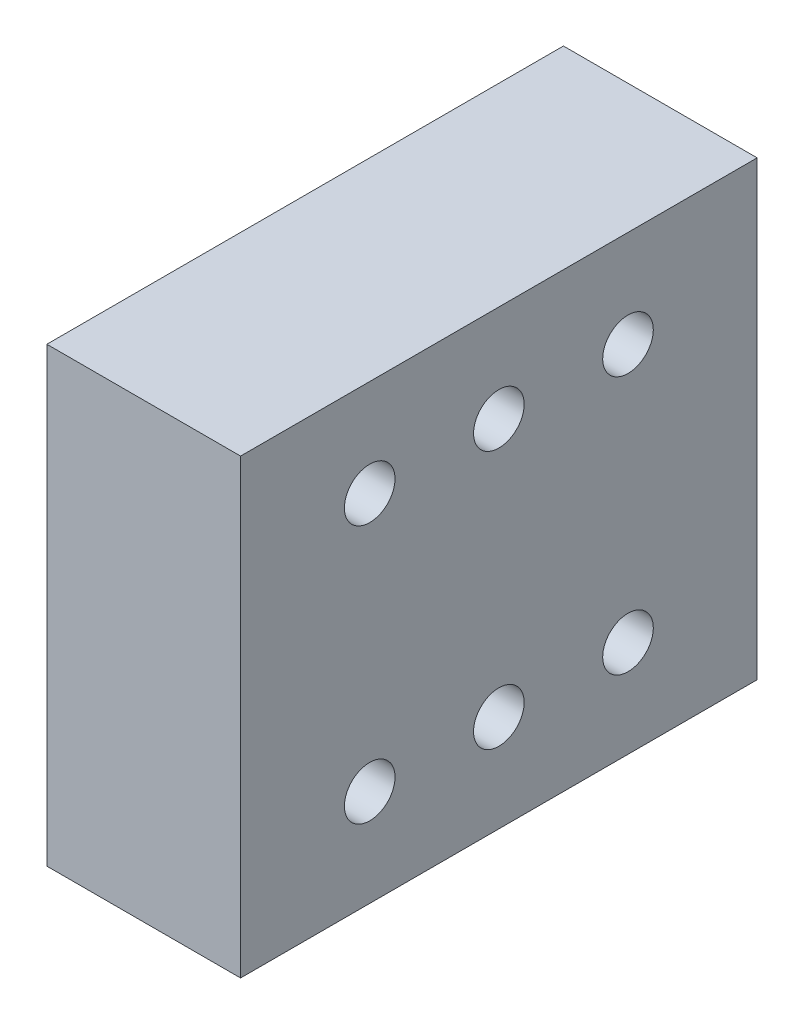
ISO-10303-21;
HEADER;
FILE_DESCRIPTION(('STEP AP214'),'2;1');
FILE_NAME('part.step','',(''),(''),'','','');
FILE_SCHEMA(('AUTOMOTIVE_DESIGN { 1 0 10303 214 1 1 1 1 }'));
ENDSEC;
DATA;
#1=APPLICATION_CONTEXT('core data for automotive mechanical design processes');
#2=APPLICATION_PROTOCOL_DEFINITION('international standard','automotive_design',2000,#1);
#3=PRODUCT_CONTEXT('',#1,'mechanical');
#4=PRODUCT('Part','Part','',(#3));
#5=PRODUCT_RELATED_PRODUCT_CATEGORY('part','',(#4));
#6=PRODUCT_DEFINITION_FORMATION('','',#4);
#7=PRODUCT_DEFINITION_CONTEXT('part definition',#1,'design');
#8=PRODUCT_DEFINITION('design','',#6,#7);
#9=PRODUCT_DEFINITION_SHAPE('','',#8);
#10=(LENGTH_UNIT() NAMED_UNIT(*) SI_UNIT(.MILLI.,.METRE.));
#11=(NAMED_UNIT(*) PLANE_ANGLE_UNIT() SI_UNIT($,.RADIAN.));
#12=(NAMED_UNIT(*) SI_UNIT($,.STERADIAN.) SOLID_ANGLE_UNIT());
#13=UNCERTAINTY_MEASURE_WITH_UNIT(LENGTH_MEASURE(1.E-05),#10,'distance_accuracy_value','');
#14=(GEOMETRIC_REPRESENTATION_CONTEXT(3) GLOBAL_UNCERTAINTY_ASSIGNED_CONTEXT((#13)) GLOBAL_UNIT_ASSIGNED_CONTEXT((#10,
#11,#12)) REPRESENTATION_CONTEXT('',''));
#15=CARTESIAN_POINT('',(0.,0.,0.));
#16=DIRECTION('',(0.,0.,1.));
#17=DIRECTION('',(1.,0.,0.));
#18=AXIS2_PLACEMENT_3D('',#15,#16,#17);
#19=CARTESIAN_POINT('',(0.,0.,50.8));
#20=DIRECTION('',(1.,0.,0.));
#21=DIRECTION('',(0.,1.,0.));
#22=AXIS2_PLACEMENT_3D('',#19,#20,#21);
#23=PLANE('',#22);
#24=CARTESIAN_POINT('',(0.,9.525,25.4));
#25=DIRECTION('',(1.,0.,0.));
#26=DIRECTION('',(0.,1.,0.));
#27=AXIS2_PLACEMENT_3D('',#24,#25,#26);
#28=CIRCLE('',#27,2.4892);
#29=CARTESIAN_POINT('',(0.,12.0142,25.4));
#30=VERTEX_POINT('',#29);
#31=EDGE_CURVE('E147',#30,#30,#28,.T.);
#32=ORIENTED_EDGE('',*,*,#31,.T.);
#33=EDGE_LOOP('',(#32));
#34=FACE_BOUND('',#33,.T.);
#35=CARTESIAN_POINT('',(0.,9.525,12.7));
#36=DIRECTION('',(1.,0.,0.));
#37=DIRECTION('',(0.,1.,0.));
#38=AXIS2_PLACEMENT_3D('',#35,#36,#37);
#39=CIRCLE('',#38,2.4892);
#40=CARTESIAN_POINT('',(0.,12.0142,12.7));
#41=VERTEX_POINT('',#40);
#42=EDGE_CURVE('E141',#41,#41,#39,.T.);
#43=ORIENTED_EDGE('',*,*,#42,.T.);
#44=EDGE_LOOP('',(#43));
#45=FACE_BOUND('',#44,.T.);
#46=CARTESIAN_POINT('',(0.,34.925,38.1));
#47=DIRECTION('',(1.,0.,0.));
#48=DIRECTION('',(0.,1.,0.));
#49=AXIS2_PLACEMENT_3D('',#46,#47,#48);
#50=CIRCLE('',#49,2.4892);
#51=CARTESIAN_POINT('',(0.,37.4142,38.1));
#52=VERTEX_POINT('',#51);
#53=EDGE_CURVE('E135',#52,#52,#50,.T.);
#54=ORIENTED_EDGE('',*,*,#53,.T.);
#55=EDGE_LOOP('',(#54));
#56=FACE_BOUND('',#55,.T.);
#57=CARTESIAN_POINT('',(0.,34.925,25.4));
#58=DIRECTION('',(1.,0.,0.));
#59=DIRECTION('',(0.,1.,0.));
#60=AXIS2_PLACEMENT_3D('',#57,#58,#59);
#61=CIRCLE('',#60,2.4892);
#62=CARTESIAN_POINT('',(0.,37.4142,25.4));
#63=VERTEX_POINT('',#62);
#64=EDGE_CURVE('E128',#63,#63,#61,.T.);
#65=ORIENTED_EDGE('',*,*,#64,.T.);
#66=EDGE_LOOP('',(#65));
#67=FACE_BOUND('',#66,.T.);
#68=CARTESIAN_POINT('',(0.,34.925,12.7));
#69=DIRECTION('',(1.,0.,0.));
#70=DIRECTION('',(0.,1.,0.));
#71=AXIS2_PLACEMENT_3D('',#68,#69,#70);
#72=CIRCLE('',#71,2.48919999999999);
#73=CARTESIAN_POINT('',(0.,37.4142,12.7));
#74=VERTEX_POINT('',#73);
#75=EDGE_CURVE('E152',#74,#74,#72,.T.);
#76=ORIENTED_EDGE('',*,*,#75,.T.);
#77=EDGE_LOOP('',(#76));
#78=FACE_BOUND('',#77,.T.);
#79=CARTESIAN_POINT('',(0.,9.525,38.1));
#80=DIRECTION('',(1.,0.,0.));
#81=DIRECTION('',(0.,1.,0.));
#82=AXIS2_PLACEMENT_3D('',#79,#80,#81);
#83=CIRCLE('',#82,2.4892);
#84=CARTESIAN_POINT('',(0.,12.0142,38.1));
#85=VERTEX_POINT('',#84);
#86=EDGE_CURVE('E111',#85,#85,#83,.T.);
#87=ORIENTED_EDGE('',*,*,#86,.T.);
#88=EDGE_LOOP('',(#87));
#89=FACE_BOUND('',#88,.T.);
#90=DIRECTION('',(0.,-1.,0.));
#91=VECTOR('',#90,1.);
#92=CARTESIAN_POINT('',(0.,0.,0.));
#93=LINE('',#92,#91);
#94=CARTESIAN_POINT('',(0.,44.45,0.));
#95=VERTEX_POINT('',#94);
#96=CARTESIAN_POINT('',(0.,0.,0.));
#97=VERTEX_POINT('',#96);
#98=EDGE_CURVE('E108',#95,#97,#93,.T.);
#99=ORIENTED_EDGE('',*,*,#98,.T.);
#100=DIRECTION('',(0.,0.,-1.));
#101=VECTOR('',#100,1.);
#102=CARTESIAN_POINT('',(0.,0.,50.8));
#103=LINE('',#102,#101);
#104=CARTESIAN_POINT('',(0.,0.,50.8));
#105=VERTEX_POINT('',#104);
#106=EDGE_CURVE('E11',#105,#97,#103,.T.);
#107=ORIENTED_EDGE('',*,*,#106,.F.);
#108=DIRECTION('',(0.,-1.,0.));
#109=VECTOR('',#108,1.);
#110=CARTESIAN_POINT('',(0.,0.,50.8));
#111=LINE('',#110,#109);
#112=CARTESIAN_POINT('',(0.,44.45,50.8));
#113=VERTEX_POINT('',#112);
#114=EDGE_CURVE('E96',#113,#105,#111,.T.);
#115=ORIENTED_EDGE('',*,*,#114,.F.);
#116=DIRECTION('',(0.,0.,-1.));
#117=VECTOR('',#116,1.);
#118=CARTESIAN_POINT('',(0.,44.45,50.8));
#119=LINE('',#118,#117);
#120=EDGE_CURVE('E104',#113,#95,#119,.T.);
#121=ORIENTED_EDGE('',*,*,#120,.T.);
#122=EDGE_LOOP('',(#99,#107,#115,#121));
#123=FACE_BOUND('',#122,.T.);
#124=ADVANCED_FACE('F45',(#34,#45,#56,#67,#78,#89,#123),#23,.F.);
#125=CARTESIAN_POINT('',(0.,0.,50.8));
#126=DIRECTION('',(0.,1.,0.));
#127=DIRECTION('',(0.,0.,1.));
#128=AXIS2_PLACEMENT_3D('',#125,#126,#127);
#129=PLANE('',#128);
#130=DIRECTION('',(1.,0.,0.));
#131=VECTOR('',#130,1.);
#132=CARTESIAN_POINT('',(0.,0.,0.));
#133=LINE('',#132,#131);
#134=CARTESIAN_POINT('',(19.05,0.,0.));
#135=VERTEX_POINT('',#134);
#136=EDGE_CURVE('E100',#97,#135,#133,.T.);
#137=ORIENTED_EDGE('',*,*,#136,.T.);
#138=DIRECTION('',(0.,0.,-1.));
#139=VECTOR('',#138,1.);
#140=CARTESIAN_POINT('',(19.05,0.,50.8));
#141=LINE('',#140,#139);
#142=CARTESIAN_POINT('',(19.05,0.,50.8));
#143=VERTEX_POINT('',#142);
#144=EDGE_CURVE('E53',#143,#135,#141,.T.);
#145=ORIENTED_EDGE('',*,*,#144,.F.);
#146=DIRECTION('',(1.,0.,0.));
#147=VECTOR('',#146,1.);
#148=CARTESIAN_POINT('',(0.,0.,50.8));
#149=LINE('',#148,#147);
#150=EDGE_CURVE('E91',#105,#143,#149,.T.);
#151=ORIENTED_EDGE('',*,*,#150,.F.);
#152=ORIENTED_EDGE('',*,*,#106,.T.);
#153=EDGE_LOOP('',(#137,#145,#151,#152));
#154=FACE_BOUND('',#153,.T.);
#155=ADVANCED_FACE('F99',(#154),#129,.F.);
#156=CARTESIAN_POINT('',(19.05,0.,50.8));
#157=DIRECTION('',(-1.,0.,0.));
#158=DIRECTION('',(0.,-1.,0.));
#159=AXIS2_PLACEMENT_3D('',#156,#157,#158);
#160=PLANE('',#159);
#161=CARTESIAN_POINT('',(19.05,9.525,25.4));
#162=DIRECTION('',(1.,0.,0.));
#163=DIRECTION('',(0.,1.,0.));
#164=AXIS2_PLACEMENT_3D('',#161,#162,#163);
#165=CIRCLE('',#164,2.4892);
#166=CARTESIAN_POINT('',(19.05,12.0142,25.4));
#167=VERTEX_POINT('',#166);
#168=EDGE_CURVE('E125',#167,#167,#165,.T.);
#169=ORIENTED_EDGE('',*,*,#168,.F.);
#170=EDGE_LOOP('',(#169));
#171=FACE_BOUND('',#170,.T.);
#172=CARTESIAN_POINT('',(19.05,9.525,12.7));
#173=DIRECTION('',(1.,0.,0.));
#174=DIRECTION('',(0.,1.,0.));
#175=AXIS2_PLACEMENT_3D('',#172,#173,#174);
#176=CIRCLE('',#175,2.4892);
#177=CARTESIAN_POINT('',(19.05,12.0142,12.7));
#178=VERTEX_POINT('',#177);
#179=EDGE_CURVE('E144',#178,#178,#176,.T.);
#180=ORIENTED_EDGE('',*,*,#179,.F.);
#181=EDGE_LOOP('',(#180));
#182=FACE_BOUND('',#181,.T.);
#183=CARTESIAN_POINT('',(19.05,34.925,38.1));
#184=DIRECTION('',(1.,0.,0.));
#185=DIRECTION('',(0.,1.,0.));
#186=AXIS2_PLACEMENT_3D('',#183,#184,#185);
#187=CIRCLE('',#186,2.4892);
#188=CARTESIAN_POINT('',(19.05,37.4142,38.1));
#189=VERTEX_POINT('',#188);
#190=EDGE_CURVE('E138',#189,#189,#187,.T.);
#191=ORIENTED_EDGE('',*,*,#190,.F.);
#192=EDGE_LOOP('',(#191));
#193=FACE_BOUND('',#192,.T.);
#194=CARTESIAN_POINT('',(19.05,34.925,25.4));
#195=DIRECTION('',(1.,0.,0.));
#196=DIRECTION('',(0.,1.,0.));
#197=AXIS2_PLACEMENT_3D('',#194,#195,#196);
#198=CIRCLE('',#197,2.4892);
#199=CARTESIAN_POINT('',(19.05,37.4142,25.4));
#200=VERTEX_POINT('',#199);
#201=EDGE_CURVE('E131',#200,#200,#198,.T.);
#202=ORIENTED_EDGE('',*,*,#201,.F.);
#203=EDGE_LOOP('',(#202));
#204=FACE_BOUND('',#203,.T.);
#205=CARTESIAN_POINT('',(19.05,34.925,12.7));
#206=DIRECTION('',(1.,0.,0.));
#207=DIRECTION('',(0.,1.,0.));
#208=AXIS2_PLACEMENT_3D('',#205,#206,#207);
#209=CIRCLE('',#208,2.48919999999999);
#210=CARTESIAN_POINT('',(19.05,37.4142,12.7));
#211=VERTEX_POINT('',#210);
#212=EDGE_CURVE('E132',#211,#211,#209,.T.);
#213=ORIENTED_EDGE('',*,*,#212,.F.);
#214=EDGE_LOOP('',(#213));
#215=FACE_BOUND('',#214,.T.);
#216=CARTESIAN_POINT('',(19.05,9.525,38.1));
#217=DIRECTION('',(1.,0.,0.));
#218=DIRECTION('',(0.,1.,0.));
#219=AXIS2_PLACEMENT_3D('',#216,#217,#218);
#220=CIRCLE('',#219,2.4892);
#221=CARTESIAN_POINT('',(19.05,12.0142,38.1));
#222=VERTEX_POINT('',#221);
#223=EDGE_CURVE('E122',#222,#222,#220,.T.);
#224=ORIENTED_EDGE('',*,*,#223,.F.);
#225=EDGE_LOOP('',(#224));
#226=FACE_BOUND('',#225,.T.);
#227=DIRECTION('',(0.,1.,0.));
#228=VECTOR('',#227,1.);
#229=CARTESIAN_POINT('',(19.05,0.,0.));
#230=LINE('',#229,#228);
#231=CARTESIAN_POINT('',(19.05,44.45,0.));
#232=VERTEX_POINT('',#231);
#233=EDGE_CURVE('E78',#135,#232,#230,.T.);
#234=ORIENTED_EDGE('',*,*,#233,.T.);
#235=DIRECTION('',(0.,0.,-1.));
#236=VECTOR('',#235,1.);
#237=CARTESIAN_POINT('',(19.05,44.45,50.8));
#238=LINE('',#237,#236);
#239=CARTESIAN_POINT('',(19.05,44.45,50.8));
#240=VERTEX_POINT('',#239);
#241=EDGE_CURVE('E101',#240,#232,#238,.T.);
#242=ORIENTED_EDGE('',*,*,#241,.F.);
#243=DIRECTION('',(0.,1.,0.));
#244=VECTOR('',#243,1.);
#245=CARTESIAN_POINT('',(19.05,0.,50.8));
#246=LINE('',#245,#244);
#247=EDGE_CURVE('E94',#143,#240,#246,.T.);
#248=ORIENTED_EDGE('',*,*,#247,.F.);
#249=ORIENTED_EDGE('',*,*,#144,.T.);
#250=EDGE_LOOP('',(#234,#242,#248,#249));
#251=FACE_BOUND('',#250,.T.);
#252=ADVANCED_FACE('F102',(#171,#182,#193,#204,#215,#226,#251),#160,.F.);
#253=CARTESIAN_POINT('',(0.,44.45,50.8));
#254=DIRECTION('',(0.,-1.,0.));
#255=DIRECTION('',(0.,0.,-1.));
#256=AXIS2_PLACEMENT_3D('',#253,#254,#255);
#257=PLANE('',#256);
#258=DIRECTION('',(-1.,0.,0.));
#259=VECTOR('',#258,1.);
#260=CARTESIAN_POINT('',(0.,44.45,0.));
#261=LINE('',#260,#259);
#262=EDGE_CURVE('E84',#232,#95,#261,.T.);
#263=ORIENTED_EDGE('',*,*,#262,.T.);
#264=ORIENTED_EDGE('',*,*,#120,.F.);
#265=DIRECTION('',(-1.,0.,0.));
#266=VECTOR('',#265,1.);
#267=CARTESIAN_POINT('',(0.,44.45,50.8));
#268=LINE('',#267,#266);
#269=EDGE_CURVE('E61',#240,#113,#268,.T.);
#270=ORIENTED_EDGE('',*,*,#269,.F.);
#271=ORIENTED_EDGE('',*,*,#241,.T.);
#272=EDGE_LOOP('',(#263,#264,#270,#271));
#273=FACE_BOUND('',#272,.T.);
#274=ADVANCED_FACE('F116',(#273),#257,.F.);
#275=CARTESIAN_POINT('',(0.,0.,50.8));
#276=DIRECTION('',(0.,0.,-1.));
#277=DIRECTION('',(-1.,0.,0.));
#278=AXIS2_PLACEMENT_3D('',#275,#276,#277);
#279=PLANE('',#278);
#280=ORIENTED_EDGE('',*,*,#114,.T.);
#281=ORIENTED_EDGE('',*,*,#150,.T.);
#282=ORIENTED_EDGE('',*,*,#247,.T.);
#283=ORIENTED_EDGE('',*,*,#269,.T.);
#284=EDGE_LOOP('',(#280,#281,#282,#283));
#285=FACE_BOUND('',#284,.T.);
#286=ADVANCED_FACE('F92',(#285),#279,.F.);
#287=CARTESIAN_POINT('',(0.,0.,0.));
#288=DIRECTION('',(0.,0.,-1.));
#289=DIRECTION('',(-1.,0.,0.));
#290=AXIS2_PLACEMENT_3D('',#287,#288,#289);
#291=PLANE('',#290);
#292=ORIENTED_EDGE('',*,*,#98,.F.);
#293=ORIENTED_EDGE('',*,*,#262,.F.);
#294=ORIENTED_EDGE('',*,*,#233,.F.);
#295=ORIENTED_EDGE('',*,*,#136,.F.);
#296=EDGE_LOOP('',(#292,#293,#294,#295));
#297=FACE_BOUND('',#296,.T.);
#298=ADVANCED_FACE('F119',(#297),#291,.T.);
#299=CARTESIAN_POINT('',(0.,9.525,38.1));
#300=DIRECTION('',(1.,0.,0.));
#301=DIRECTION('',(0.,1.,0.));
#302=AXIS2_PLACEMENT_3D('',#299,#300,#301);
#303=CYLINDRICAL_SURFACE('',#302,2.4892);
#304=ORIENTED_EDGE('',*,*,#86,.F.);
#305=EDGE_LOOP('',(#304));
#306=FACE_BOUND('',#305,.T.);
#307=ORIENTED_EDGE('',*,*,#223,.T.);
#308=EDGE_LOOP('',(#307));
#309=FACE_BOUND('',#308,.T.);
#310=ADVANCED_FACE('F166',(#306,#309),#303,.F.);
#311=CARTESIAN_POINT('',(0.,34.925,12.7));
#312=DIRECTION('',(1.,0.,0.));
#313=DIRECTION('',(0.,1.,0.));
#314=AXIS2_PLACEMENT_3D('',#311,#312,#313);
#315=CYLINDRICAL_SURFACE('',#314,2.48919999999999);
#316=ORIENTED_EDGE('',*,*,#75,.F.);
#317=EDGE_LOOP('',(#316));
#318=FACE_BOUND('',#317,.T.);
#319=ORIENTED_EDGE('',*,*,#212,.T.);
#320=EDGE_LOOP('',(#319));
#321=FACE_BOUND('',#320,.T.);
#322=ADVANCED_FACE('F158',(#318,#321),#315,.F.);
#323=CARTESIAN_POINT('',(0.,34.925,25.4));
#324=DIRECTION('',(1.,0.,0.));
#325=DIRECTION('',(0.,1.,0.));
#326=AXIS2_PLACEMENT_3D('',#323,#324,#325);
#327=CYLINDRICAL_SURFACE('',#326,2.4892);
#328=ORIENTED_EDGE('',*,*,#64,.F.);
#329=EDGE_LOOP('',(#328));
#330=FACE_BOUND('',#329,.T.);
#331=ORIENTED_EDGE('',*,*,#201,.T.);
#332=EDGE_LOOP('',(#331));
#333=FACE_BOUND('',#332,.T.);
#334=ADVANCED_FACE('F173',(#330,#333),#327,.F.);
#335=CARTESIAN_POINT('',(0.,34.925,38.1));
#336=DIRECTION('',(1.,0.,0.));
#337=DIRECTION('',(0.,1.,0.));
#338=AXIS2_PLACEMENT_3D('',#335,#336,#337);
#339=CYLINDRICAL_SURFACE('',#338,2.4892);
#340=ORIENTED_EDGE('',*,*,#53,.F.);
#341=EDGE_LOOP('',(#340));
#342=FACE_BOUND('',#341,.T.);
#343=ORIENTED_EDGE('',*,*,#190,.T.);
#344=EDGE_LOOP('',(#343));
#345=FACE_BOUND('',#344,.T.);
#346=ADVANCED_FACE('F199',(#342,#345),#339,.F.);
#347=CARTESIAN_POINT('',(0.,9.525,12.7));
#348=DIRECTION('',(1.,0.,0.));
#349=DIRECTION('',(0.,1.,0.));
#350=AXIS2_PLACEMENT_3D('',#347,#348,#349);
#351=CYLINDRICAL_SURFACE('',#350,2.4892);
#352=ORIENTED_EDGE('',*,*,#42,.F.);
#353=EDGE_LOOP('',(#352));
#354=FACE_BOUND('',#353,.T.);
#355=ORIENTED_EDGE('',*,*,#179,.T.);
#356=EDGE_LOOP('',(#355));
#357=FACE_BOUND('',#356,.T.);
#358=ADVANCED_FACE('F205',(#354,#357),#351,.F.);
#359=CARTESIAN_POINT('',(0.,9.525,25.4));
#360=DIRECTION('',(1.,0.,0.));
#361=DIRECTION('',(0.,1.,0.));
#362=AXIS2_PLACEMENT_3D('',#359,#360,#361);
#363=CYLINDRICAL_SURFACE('',#362,2.4892);
#364=ORIENTED_EDGE('',*,*,#31,.F.);
#365=EDGE_LOOP('',(#364));
#366=FACE_BOUND('',#365,.T.);
#367=ORIENTED_EDGE('',*,*,#168,.T.);
#368=EDGE_LOOP('',(#367));
#369=FACE_BOUND('',#368,.T.);
#370=ADVANCED_FACE('F211',(#366,#369),#363,.F.);
#371=CLOSED_SHELL('',(#124,#155,#252,#274,#286,#298,#310,#322,#334,#346,#358,#370));
#372=MANIFOLD_SOLID_BREP('B2',#371);
#373=ADVANCED_BREP_SHAPE_REPRESENTATION('',(#18,#372),#14);
#374=SHAPE_DEFINITION_REPRESENTATION(#9,#373);
ENDSEC;
END-ISO-10303-21;
